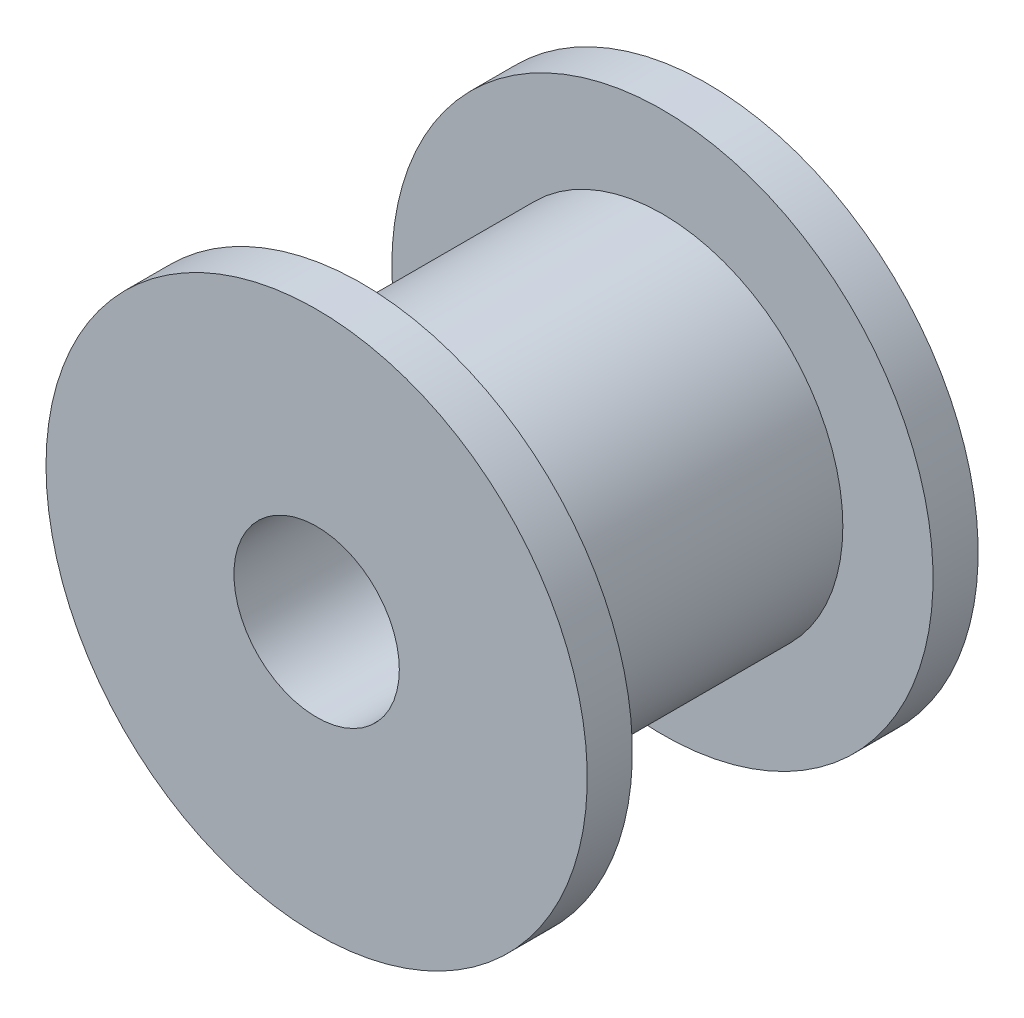
ISO-10303-21;
HEADER;
FILE_DESCRIPTION(('STEP AP214'),'2;1');
FILE_NAME('part.step','',(''),(''),'','','');
FILE_SCHEMA(('AUTOMOTIVE_DESIGN { 1 0 10303 214 1 1 1 1 }'));
ENDSEC;
DATA;
#1=APPLICATION_CONTEXT('core data for automotive mechanical design processes');
#2=APPLICATION_PROTOCOL_DEFINITION('international standard','automotive_design',2000,#1);
#3=PRODUCT_CONTEXT('',#1,'mechanical');
#4=PRODUCT('Part','Part','',(#3));
#5=PRODUCT_RELATED_PRODUCT_CATEGORY('part','',(#4));
#6=PRODUCT_DEFINITION_FORMATION('','',#4);
#7=PRODUCT_DEFINITION_CONTEXT('part definition',#1,'design');
#8=PRODUCT_DEFINITION('design','',#6,#7);
#9=PRODUCT_DEFINITION_SHAPE('','',#8);
#10=(LENGTH_UNIT() NAMED_UNIT(*) SI_UNIT(.MILLI.,.METRE.));
#11=(NAMED_UNIT(*) PLANE_ANGLE_UNIT() SI_UNIT($,.RADIAN.));
#12=(NAMED_UNIT(*) SI_UNIT($,.STERADIAN.) SOLID_ANGLE_UNIT());
#13=UNCERTAINTY_MEASURE_WITH_UNIT(LENGTH_MEASURE(1.E-05),#10,'distance_accuracy_value','');
#14=(GEOMETRIC_REPRESENTATION_CONTEXT(3) GLOBAL_UNCERTAINTY_ASSIGNED_CONTEXT((#13)) GLOBAL_UNIT_ASSIGNED_CONTEXT((#10,
#11,#12)) REPRESENTATION_CONTEXT('',''));
#15=CARTESIAN_POINT('',(0.,0.,0.));
#16=DIRECTION('',(0.,0.,1.));
#17=DIRECTION('',(1.,0.,0.));
#18=AXIS2_PLACEMENT_3D('',#15,#16,#17);
#19=CARTESIAN_POINT('',(0.,0.,6.5));
#20=DIRECTION('',(0.,0.,-1.));
#21=DIRECTION('',(-1.,0.,0.));
#22=AXIS2_PLACEMENT_3D('',#19,#20,#21);
#23=CYLINDRICAL_SURFACE('',#22,9.);
#24=CARTESIAN_POINT('',(0.,0.,-6.5));
#25=DIRECTION('',(0.,0.,1.));
#26=DIRECTION('',(1.,0.,0.));
#27=AXIS2_PLACEMENT_3D('',#24,#25,#26);
#28=CIRCLE('',#27,9.);
#29=CARTESIAN_POINT('',(-9.,0.,-6.5));
#30=VERTEX_POINT('',#29);
#31=EDGE_CURVE('E41',#30,#30,#28,.T.);
#32=CARTESIAN_POINT('',(0.,0.,-5.));
#33=DIRECTION('',(0.,0.,1.));
#34=DIRECTION('',(1.,0.,0.));
#35=AXIS2_PLACEMENT_3D('',#32,#33,#34);
#36=CIRCLE('',#35,9.);
#37=CARTESIAN_POINT('',(-9.,0.,-5.));
#38=VERTEX_POINT('',#37);
#39=EDGE_CURVE('E48',#38,#38,#36,.T.);
#40=CARTESIAN_POINT('',(-9.,0.,-6.5));
#41=CARTESIAN_POINT('',(-9.,0.,-6.484375));
#42=CARTESIAN_POINT('',(-9.,0.,-6.46875));
#43=CARTESIAN_POINT('',(-9.,0.,-6.4375));
#44=CARTESIAN_POINT('',(-9.,0.,-6.421875));
#45=CARTESIAN_POINT('',(-9.,0.,-6.390625));
#46=CARTESIAN_POINT('',(-9.,0.,-6.375));
#47=CARTESIAN_POINT('',(-9.,0.,-6.34375));
#48=CARTESIAN_POINT('',(-9.,0.,-6.328125));
#49=CARTESIAN_POINT('',(-9.,0.,-6.296875));
#50=CARTESIAN_POINT('',(-9.,0.,-6.28125));
#51=CARTESIAN_POINT('',(-9.,0.,-6.25));
#52=CARTESIAN_POINT('',(-9.,0.,-6.234375));
#53=CARTESIAN_POINT('',(-9.,0.,-6.203125));
#54=CARTESIAN_POINT('',(-9.,0.,-6.1875));
#55=CARTESIAN_POINT('',(-9.,0.,-6.15625));
#56=CARTESIAN_POINT('',(-9.,0.,-6.140625));
#57=CARTESIAN_POINT('',(-9.,0.,-6.109375));
#58=CARTESIAN_POINT('',(-9.,0.,-6.09375));
#59=CARTESIAN_POINT('',(-9.,0.,-6.0625));
#60=CARTESIAN_POINT('',(-9.,0.,-6.046875));
#61=CARTESIAN_POINT('',(-9.,0.,-6.015625));
#62=CARTESIAN_POINT('',(-9.,0.,-6.));
#63=CARTESIAN_POINT('',(-9.,0.,-5.96875));
#64=CARTESIAN_POINT('',(-9.,0.,-5.953125));
#65=CARTESIAN_POINT('',(-9.,0.,-5.921875));
#66=CARTESIAN_POINT('',(-9.,0.,-5.90625));
#67=CARTESIAN_POINT('',(-9.,0.,-5.875));
#68=CARTESIAN_POINT('',(-9.,0.,-5.859375));
#69=CARTESIAN_POINT('',(-9.,0.,-5.828125));
#70=CARTESIAN_POINT('',(-9.,0.,-5.8125));
#71=CARTESIAN_POINT('',(-9.,0.,-5.78125));
#72=CARTESIAN_POINT('',(-9.,0.,-5.765625));
#73=CARTESIAN_POINT('',(-9.,0.,-5.734375));
#74=CARTESIAN_POINT('',(-9.,0.,-5.71875));
#75=CARTESIAN_POINT('',(-9.,0.,-5.6875));
#76=CARTESIAN_POINT('',(-9.,0.,-5.671875));
#77=CARTESIAN_POINT('',(-9.,0.,-5.640625));
#78=CARTESIAN_POINT('',(-9.,0.,-5.625));
#79=CARTESIAN_POINT('',(-9.,0.,-5.59375));
#80=CARTESIAN_POINT('',(-9.,0.,-5.578125));
#81=CARTESIAN_POINT('',(-9.,0.,-5.546875));
#82=CARTESIAN_POINT('',(-9.,0.,-5.53125));
#83=CARTESIAN_POINT('',(-9.,0.,-5.5));
#84=CARTESIAN_POINT('',(-9.,0.,-5.484375));
#85=CARTESIAN_POINT('',(-9.,0.,-5.453125));
#86=CARTESIAN_POINT('',(-9.,0.,-5.4375));
#87=CARTESIAN_POINT('',(-9.,0.,-5.40625));
#88=CARTESIAN_POINT('',(-9.,0.,-5.390625));
#89=CARTESIAN_POINT('',(-9.,0.,-5.359375));
#90=CARTESIAN_POINT('',(-9.,0.,-5.34375));
#91=CARTESIAN_POINT('',(-9.,0.,-5.3125));
#92=CARTESIAN_POINT('',(-9.,0.,-5.296875));
#93=CARTESIAN_POINT('',(-9.,0.,-5.265625));
#94=CARTESIAN_POINT('',(-9.,0.,-5.25));
#95=CARTESIAN_POINT('',(-9.,0.,-5.21875));
#96=CARTESIAN_POINT('',(-9.,0.,-5.203125));
#97=CARTESIAN_POINT('',(-9.,0.,-5.171875));
#98=CARTESIAN_POINT('',(-9.,0.,-5.15625));
#99=CARTESIAN_POINT('',(-9.,0.,-5.125));
#100=CARTESIAN_POINT('',(-9.,0.,-5.109375));
#101=CARTESIAN_POINT('',(-9.,0.,-5.078125));
#102=CARTESIAN_POINT('',(-9.,0.,-5.0625));
#103=CARTESIAN_POINT('',(-9.,0.,-5.03125));
#104=CARTESIAN_POINT('',(-9.,0.,-5.015625));
#105=CARTESIAN_POINT('',(-9.,0.,-5.));
#106=B_SPLINE_CURVE_WITH_KNOTS('',3,(#40,#41,#42,#43,#44,#45,#46,#47,#48,#49,#50,#51,#52,#53,
#54,#55,#56,#57,#58,#59,#60,#61,#62,#63,#64,#65,#66,#67,#68,#69,#70,#71,#72,#73,#74,#75,#76,#77,
#78,#79,#80,#81,#82,#83,#84,#85,#86,#87,#88,#89,#90,#91,#92,#93,#94,#95,#96,#97,#98,#99,#100,
#101,#102,#103,#104,#105),.UNSPECIFIED.,.F.,.F.,(4,2,2,2,2,2,2,2,2,2,2,2,2,2,2,2,2,2,2,2,2,2,2,
2,2,2,2,2,2,2,2,2,4),(0.,0.046875,0.0937500000000001,0.140625,0.1875,0.234375,0.28125,0.328125,
0.375,0.421874999999999,0.468749999999999,0.515624999999999,0.562499999999999,0.609374999999999,
0.656249999999999,0.703124999999999,0.749999999999999,0.796874999999999,0.843749999999999,
0.890624999999999,0.937499999999999,0.984374999999999,1.03125,1.078125,1.125,1.171875,1.21875,
1.265625,1.3125,1.359375,1.40625,1.453125,1.5),.UNSPECIFIED.);
#107=EDGE_CURVE('BSEAM37',#30,#38,#106,.T.);
#108=ORIENTED_EDGE('',*,*,#31,.T.);
#109=ORIENTED_EDGE('',*,*,#39,.F.);
#110=ORIENTED_EDGE('',*,*,#107,.T.);
#111=ORIENTED_EDGE('',*,*,#107,.F.);
#112=EDGE_LOOP('',(#108,#110,#109,#111));
#113=FACE_BOUND('',#112,.T.);
#114=ADVANCED_FACE('F37',(#113),#23,.T.);
#115=CARTESIAN_POINT('',(0.,0.,-6.5));
#116=DIRECTION('',(0.,0.,1.));
#117=DIRECTION('',(1.,0.,0.));
#118=AXIS2_PLACEMENT_3D('',#115,#116,#117);
#119=PLANE('',#118);
#120=CARTESIAN_POINT('',(0.,0.,-6.5));
#121=DIRECTION('',(0.,0.,1.));
#122=DIRECTION('',(1.,0.,0.));
#123=AXIS2_PLACEMENT_3D('',#120,#121,#122);
#124=CIRCLE('',#123,2.75);
#125=CARTESIAN_POINT('',(2.75,0.,-6.5));
#126=VERTEX_POINT('',#125);
#127=EDGE_CURVE('E59',#126,#126,#124,.T.);
#128=ORIENTED_EDGE('',*,*,#127,.T.);
#129=EDGE_LOOP('',(#128));
#130=FACE_BOUND('',#129,.T.);
#131=ORIENTED_EDGE('',*,*,#31,.F.);
#132=EDGE_LOOP('',(#131));
#133=FACE_BOUND('',#132,.T.);
#134=ADVANCED_FACE('F68',(#130,#133),#119,.F.);
#135=CARTESIAN_POINT('',(0.,0.,-5.));
#136=DIRECTION('',(0.,0.,1.));
#137=DIRECTION('',(1.,0.,0.));
#138=AXIS2_PLACEMENT_3D('',#135,#136,#137);
#139=PLANE('',#138);
#140=CARTESIAN_POINT('',(0.,0.,-5.));
#141=DIRECTION('',(0.,0.,1.));
#142=DIRECTION('',(1.,0.,0.));
#143=AXIS2_PLACEMENT_3D('',#140,#141,#142);
#144=CIRCLE('',#143,6.);
#145=CARTESIAN_POINT('',(6.,0.,-5.));
#146=VERTEX_POINT('',#145);
#147=EDGE_CURVE('E53',#146,#146,#144,.T.);
#148=ORIENTED_EDGE('',*,*,#147,.F.);
#149=EDGE_LOOP('',(#148));
#150=FACE_BOUND('',#149,.T.);
#151=ORIENTED_EDGE('',*,*,#39,.T.);
#152=EDGE_LOOP('',(#151));
#153=FACE_BOUND('',#152,.T.);
#154=ADVANCED_FACE('F95',(#150,#153),#139,.T.);
#155=CARTESIAN_POINT('',(0.,0.,5.));
#156=DIRECTION('',(0.,0.,1.));
#157=DIRECTION('',(1.,0.,0.));
#158=AXIS2_PLACEMENT_3D('',#155,#156,#157);
#159=PLANE('',#158);
#160=CARTESIAN_POINT('',(0.,0.,5.));
#161=DIRECTION('',(0.,0.,1.));
#162=DIRECTION('',(1.,0.,0.));
#163=AXIS2_PLACEMENT_3D('',#160,#161,#162);
#164=CIRCLE('',#163,6.);
#165=CARTESIAN_POINT('',(6.,0.,5.));
#166=VERTEX_POINT('',#165);
#167=EDGE_CURVE('E56',#166,#166,#164,.T.);
#168=ORIENTED_EDGE('',*,*,#167,.T.);
#169=EDGE_LOOP('',(#168));
#170=FACE_BOUND('',#169,.T.);
#171=CARTESIAN_POINT('',(0.,0.,5.));
#172=DIRECTION('',(0.,0.,1.));
#173=DIRECTION('',(1.,0.,0.));
#174=AXIS2_PLACEMENT_3D('',#171,#172,#173);
#175=CIRCLE('',#174,9.);
#176=CARTESIAN_POINT('',(-9.,0.,5.));
#177=VERTEX_POINT('',#176);
#178=EDGE_CURVE('E50',#177,#177,#175,.T.);
#179=ORIENTED_EDGE('',*,*,#178,.F.);
#180=EDGE_LOOP('',(#179));
#181=FACE_BOUND('',#180,.T.);
#182=ADVANCED_FACE('F86',(#170,#181),#159,.F.);
#183=CARTESIAN_POINT('',(0.,0.,-5.));
#184=DIRECTION('',(0.,0.,1.));
#185=DIRECTION('',(1.,0.,0.));
#186=AXIS2_PLACEMENT_3D('',#183,#184,#185);
#187=CYLINDRICAL_SURFACE('',#186,6.);
#188=ORIENTED_EDGE('',*,*,#147,.T.);
#189=EDGE_LOOP('',(#188));
#190=FACE_BOUND('',#189,.T.);
#191=ORIENTED_EDGE('',*,*,#167,.F.);
#192=EDGE_LOOP('',(#191));
#193=FACE_BOUND('',#192,.T.);
#194=ADVANCED_FACE('F79',(#190,#193),#187,.T.);
#195=CARTESIAN_POINT('',(0.,0.,6.5));
#196=DIRECTION('',(0.,0.,1.));
#197=DIRECTION('',(1.,0.,0.));
#198=AXIS2_PLACEMENT_3D('',#195,#196,#197);
#199=PLANE('',#198);
#200=CARTESIAN_POINT('',(0.,0.,6.5));
#201=DIRECTION('',(0.,0.,1.));
#202=DIRECTION('',(1.,0.,0.));
#203=AXIS2_PLACEMENT_3D('',#200,#201,#202);
#204=CIRCLE('',#203,2.75);
#205=CARTESIAN_POINT('',(2.75,0.,6.5));
#206=VERTEX_POINT('',#205);
#207=EDGE_CURVE('E62',#206,#206,#204,.T.);
#208=ORIENTED_EDGE('',*,*,#207,.F.);
#209=EDGE_LOOP('',(#208));
#210=FACE_BOUND('',#209,.T.);
#211=CARTESIAN_POINT('',(0.,0.,6.5));
#212=DIRECTION('',(0.,0.,1.));
#213=DIRECTION('',(1.,0.,0.));
#214=AXIS2_PLACEMENT_3D('',#211,#212,#213);
#215=CIRCLE('',#214,9.);
#216=CARTESIAN_POINT('',(-9.,0.,6.5));
#217=VERTEX_POINT('',#216);
#218=EDGE_CURVE('E10',#217,#217,#215,.T.);
#219=ORIENTED_EDGE('',*,*,#218,.T.);
#220=EDGE_LOOP('',(#219));
#221=FACE_BOUND('',#220,.T.);
#222=ADVANCED_FACE('F77',(#210,#221),#199,.T.);
#223=CARTESIAN_POINT('',(-9.,0.,5.));
#224=CARTESIAN_POINT('',(-9.,0.,5.015625));
#225=CARTESIAN_POINT('',(-9.,0.,5.03125));
#226=CARTESIAN_POINT('',(-9.,0.,5.0625));
#227=CARTESIAN_POINT('',(-9.,0.,5.078125));
#228=CARTESIAN_POINT('',(-9.,0.,5.109375));
#229=CARTESIAN_POINT('',(-9.,0.,5.125));
#230=CARTESIAN_POINT('',(-9.,0.,5.15625));
#231=CARTESIAN_POINT('',(-9.,0.,5.171875));
#232=CARTESIAN_POINT('',(-9.,0.,5.203125));
#233=CARTESIAN_POINT('',(-9.,0.,5.21875));
#234=CARTESIAN_POINT('',(-9.,0.,5.25));
#235=CARTESIAN_POINT('',(-9.,0.,5.265625));
#236=CARTESIAN_POINT('',(-9.,0.,5.296875));
#237=CARTESIAN_POINT('',(-9.,0.,5.3125));
#238=CARTESIAN_POINT('',(-9.,0.,5.34375));
#239=CARTESIAN_POINT('',(-9.,0.,5.359375));
#240=CARTESIAN_POINT('',(-9.,0.,5.390625));
#241=CARTESIAN_POINT('',(-9.,0.,5.40625));
#242=CARTESIAN_POINT('',(-9.,0.,5.4375));
#243=CARTESIAN_POINT('',(-9.,0.,5.453125));
#244=CARTESIAN_POINT('',(-9.,0.,5.484375));
#245=CARTESIAN_POINT('',(-9.,0.,5.5));
#246=CARTESIAN_POINT('',(-9.,0.,5.53125));
#247=CARTESIAN_POINT('',(-9.,0.,5.546875));
#248=CARTESIAN_POINT('',(-9.,0.,5.578125));
#249=CARTESIAN_POINT('',(-9.,0.,5.59375));
#250=CARTESIAN_POINT('',(-9.,0.,5.625));
#251=CARTESIAN_POINT('',(-9.,0.,5.640625));
#252=CARTESIAN_POINT('',(-9.,0.,5.671875));
#253=CARTESIAN_POINT('',(-9.,0.,5.6875));
#254=CARTESIAN_POINT('',(-9.,0.,5.71875));
#255=CARTESIAN_POINT('',(-9.,0.,5.734375));
#256=CARTESIAN_POINT('',(-9.,0.,5.765625));
#257=CARTESIAN_POINT('',(-9.,0.,5.78125));
#258=CARTESIAN_POINT('',(-9.,0.,5.8125));
#259=CARTESIAN_POINT('',(-9.,0.,5.828125));
#260=CARTESIAN_POINT('',(-9.,0.,5.859375));
#261=CARTESIAN_POINT('',(-9.,0.,5.875));
#262=CARTESIAN_POINT('',(-9.,0.,5.90625));
#263=CARTESIAN_POINT('',(-9.,0.,5.921875));
#264=CARTESIAN_POINT('',(-9.,0.,5.953125));
#265=CARTESIAN_POINT('',(-9.,0.,5.96875));
#266=CARTESIAN_POINT('',(-9.,0.,6.));
#267=CARTESIAN_POINT('',(-9.,0.,6.015625));
#268=CARTESIAN_POINT('',(-9.,0.,6.046875));
#269=CARTESIAN_POINT('',(-9.,0.,6.0625));
#270=CARTESIAN_POINT('',(-9.,0.,6.09375));
#271=CARTESIAN_POINT('',(-9.,0.,6.109375));
#272=CARTESIAN_POINT('',(-9.,0.,6.140625));
#273=CARTESIAN_POINT('',(-9.,0.,6.15625));
#274=CARTESIAN_POINT('',(-9.,0.,6.1875));
#275=CARTESIAN_POINT('',(-9.,0.,6.203125));
#276=CARTESIAN_POINT('',(-9.,0.,6.234375));
#277=CARTESIAN_POINT('',(-9.,0.,6.25));
#278=CARTESIAN_POINT('',(-9.,0.,6.28125));
#279=CARTESIAN_POINT('',(-9.,0.,6.296875));
#280=CARTESIAN_POINT('',(-9.,0.,6.328125));
#281=CARTESIAN_POINT('',(-9.,0.,6.34375));
#282=CARTESIAN_POINT('',(-9.,0.,6.375));
#283=CARTESIAN_POINT('',(-9.,0.,6.390625));
#284=CARTESIAN_POINT('',(-9.,0.,6.421875));
#285=CARTESIAN_POINT('',(-9.,0.,6.4375));
#286=CARTESIAN_POINT('',(-9.,0.,6.46875));
#287=CARTESIAN_POINT('',(-9.,0.,6.484375));
#288=CARTESIAN_POINT('',(-9.,0.,6.5));
#289=B_SPLINE_CURVE_WITH_KNOTS('',3,(#223,#224,#225,#226,#227,#228,#229,#230,#231,#232,#233,
#234,#235,#236,#237,#238,#239,#240,#241,#242,#243,#244,#245,#246,#247,#248,#249,#250,#251,#252,
#253,#254,#255,#256,#257,#258,#259,#260,#261,#262,#263,#264,#265,#266,#267,#268,#269,#270,#271,
#272,#273,#274,#275,#276,#277,#278,#279,#280,#281,#282,#283,#284,#285,#286,#287,#288),
.UNSPECIFIED.,.F.,.F.,(4,2,2,2,2,2,2,2,2,2,2,2,2,2,2,2,2,2,2,2,2,2,2,2,2,2,2,2,2,2,2,2,4),(0.,
0.046875,0.0937500000000001,0.140624999999999,0.187499999999999,0.234374999999999,
0.281249999999999,0.328124999999999,0.374999999999999,0.421875,0.46875,0.515625,0.5625,0.609375,
0.65625,0.703125,0.75,0.796875,0.84375,0.890624999999999,0.937499999999999,0.984374999999999,
1.03125,1.078125,1.125,1.171875,1.21875,1.265625,1.3125,1.359375,1.40625,1.453125,1.5),.UNSPECIFIED.);
#290=EDGE_CURVE('BSEAM39',#177,#217,#289,.T.);
#291=ORIENTED_EDGE('',*,*,#178,.T.);
#292=ORIENTED_EDGE('',*,*,#218,.F.);
#293=ORIENTED_EDGE('',*,*,#290,.T.);
#294=ORIENTED_EDGE('',*,*,#290,.F.);
#295=EDGE_LOOP('',(#291,#293,#292,#294));
#296=FACE_BOUND('',#295,.T.);
#297=ADVANCED_FACE('F39',(#296),#23,.T.);
#298=CARTESIAN_POINT('',(0.,0.,-6.5));
#299=DIRECTION('',(0.,0.,1.));
#300=DIRECTION('',(1.,0.,0.));
#301=AXIS2_PLACEMENT_3D('',#298,#299,#300);
#302=CYLINDRICAL_SURFACE('',#301,2.75);
#303=CARTESIAN_POINT('',(2.75,0.,-6.5));
#304=CARTESIAN_POINT('',(2.75,0.,-6.36458333333333));
#305=CARTESIAN_POINT('',(2.75,0.,-6.22916666666667));
#306=CARTESIAN_POINT('',(2.75,0.,-5.95833333333333));
#307=CARTESIAN_POINT('',(2.75,0.,-5.82291666666667));
#308=CARTESIAN_POINT('',(2.75,0.,-5.55208333333333));
#309=CARTESIAN_POINT('',(2.75,0.,-5.41666666666667));
#310=CARTESIAN_POINT('',(2.75,0.,-5.14583333333333));
#311=CARTESIAN_POINT('',(2.75,0.,-5.01041666666667));
#312=CARTESIAN_POINT('',(2.75,0.,-4.73958333333333));
#313=CARTESIAN_POINT('',(2.75,0.,-4.60416666666667));
#314=CARTESIAN_POINT('',(2.75,0.,-4.33333333333333));
#315=CARTESIAN_POINT('',(2.75,0.,-4.19791666666667));
#316=CARTESIAN_POINT('',(2.75,0.,-3.92708333333333));
#317=CARTESIAN_POINT('',(2.75,0.,-3.79166666666667));
#318=CARTESIAN_POINT('',(2.75,0.,-3.52083333333333));
#319=CARTESIAN_POINT('',(2.75,0.,-3.38541666666667));
#320=CARTESIAN_POINT('',(2.75,0.,-3.11458333333333));
#321=CARTESIAN_POINT('',(2.75,0.,-2.97916666666667));
#322=CARTESIAN_POINT('',(2.75,0.,-2.70833333333333));
#323=CARTESIAN_POINT('',(2.75,0.,-2.57291666666667));
#324=CARTESIAN_POINT('',(2.75,0.,-2.30208333333333));
#325=CARTESIAN_POINT('',(2.75,0.,-2.16666666666667));
#326=CARTESIAN_POINT('',(2.75,0.,-1.89583333333333));
#327=CARTESIAN_POINT('',(2.75,0.,-1.76041666666667));
#328=CARTESIAN_POINT('',(2.75,0.,-1.48958333333333));
#329=CARTESIAN_POINT('',(2.75,0.,-1.35416666666667));
#330=CARTESIAN_POINT('',(2.75,0.,-1.08333333333333));
#331=CARTESIAN_POINT('',(2.75,0.,-0.947916666666667));
#332=CARTESIAN_POINT('',(2.75,0.,-0.677083333333333));
#333=CARTESIAN_POINT('',(2.75,0.,-0.541666666666667));
#334=CARTESIAN_POINT('',(2.75,0.,-0.270833333333334));
#335=CARTESIAN_POINT('',(2.75,0.,-0.135416666666667));
#336=CARTESIAN_POINT('',(2.75,0.,0.135416666666667));
#337=CARTESIAN_POINT('',(2.75,0.,0.270833333333334));
#338=CARTESIAN_POINT('',(2.75,0.,0.541666666666667));
#339=CARTESIAN_POINT('',(2.75,0.,0.677083333333333));
#340=CARTESIAN_POINT('',(2.75,0.,0.947916666666667));
#341=CARTESIAN_POINT('',(2.75,0.,1.08333333333333));
#342=CARTESIAN_POINT('',(2.75,0.,1.35416666666667));
#343=CARTESIAN_POINT('',(2.75,0.,1.48958333333333));
#344=CARTESIAN_POINT('',(2.75,0.,1.76041666666667));
#345=CARTESIAN_POINT('',(2.75,0.,1.89583333333333));
#346=CARTESIAN_POINT('',(2.75,0.,2.16666666666667));
#347=CARTESIAN_POINT('',(2.75,0.,2.30208333333333));
#348=CARTESIAN_POINT('',(2.75,0.,2.57291666666667));
#349=CARTESIAN_POINT('',(2.75,0.,2.70833333333333));
#350=CARTESIAN_POINT('',(2.75,0.,2.97916666666667));
#351=CARTESIAN_POINT('',(2.75,0.,3.11458333333333));
#352=CARTESIAN_POINT('',(2.75,0.,3.38541666666667));
#353=CARTESIAN_POINT('',(2.75,0.,3.52083333333333));
#354=CARTESIAN_POINT('',(2.75,0.,3.79166666666667));
#355=CARTESIAN_POINT('',(2.75,0.,3.92708333333333));
#356=CARTESIAN_POINT('',(2.75,0.,4.19791666666667));
#357=CARTESIAN_POINT('',(2.75,0.,4.33333333333333));
#358=CARTESIAN_POINT('',(2.75,0.,4.60416666666667));
#359=CARTESIAN_POINT('',(2.75,0.,4.73958333333333));
#360=CARTESIAN_POINT('',(2.75,0.,5.01041666666667));
#361=CARTESIAN_POINT('',(2.75,0.,5.14583333333333));
#362=CARTESIAN_POINT('',(2.75,0.,5.41666666666667));
#363=CARTESIAN_POINT('',(2.75,0.,5.55208333333333));
#364=CARTESIAN_POINT('',(2.75,0.,5.82291666666667));
#365=CARTESIAN_POINT('',(2.75,0.,5.95833333333333));
#366=CARTESIAN_POINT('',(2.75,0.,6.22916666666667));
#367=CARTESIAN_POINT('',(2.75,0.,6.36458333333333));
#368=CARTESIAN_POINT('',(2.75,0.,6.5));
#369=B_SPLINE_CURVE_WITH_KNOTS('',3,(#303,#304,#305,#306,#307,#308,#309,#310,#311,#312,#313,
#314,#315,#316,#317,#318,#319,#320,#321,#322,#323,#324,#325,#326,#327,#328,#329,#330,#331,#332,
#333,#334,#335,#336,#337,#338,#339,#340,#341,#342,#343,#344,#345,#346,#347,#348,#349,#350,#351,
#352,#353,#354,#355,#356,#357,#358,#359,#360,#361,#362,#363,#364,#365,#366,#367,#368),
.UNSPECIFIED.,.F.,.F.,(4,2,2,2,2,2,2,2,2,2,2,2,2,2,2,2,2,2,2,2,2,2,2,2,2,2,2,2,2,2,2,2,4),(0.,
0.40625,0.8125,1.21875,1.625,2.03125,2.4375,2.84375,3.25,3.65625,4.0625,4.46875,4.875,5.28125,
5.6875,6.09375,6.5,6.90625,7.3125,7.71875,8.125,8.53125,8.9375,9.34375,9.75,10.15625,10.5625,
10.96875,11.375,11.78125,12.1875,12.59375,13.),.UNSPECIFIED.);
#370=EDGE_CURVE('BSEAM71',#126,#206,#369,.T.);
#371=ORIENTED_EDGE('',*,*,#127,.F.);
#372=ORIENTED_EDGE('',*,*,#207,.T.);
#373=ORIENTED_EDGE('',*,*,#370,.T.);
#374=ORIENTED_EDGE('',*,*,#370,.F.);
#375=EDGE_LOOP('',(#371,#373,#372,#374));
#376=FACE_BOUND('',#375,.T.);
#377=ADVANCED_FACE('F71',(#376),#302,.F.);
#378=CLOSED_SHELL('',(#114,#134,#154,#182,#194,#222,#297,#377));
#379=MANIFOLD_SOLID_BREP('B2',#378);
#380=ADVANCED_BREP_SHAPE_REPRESENTATION('',(#18,#379),#14);
#381=SHAPE_DEFINITION_REPRESENTATION(#9,#380);
ENDSEC;
END-ISO-10303-21;
